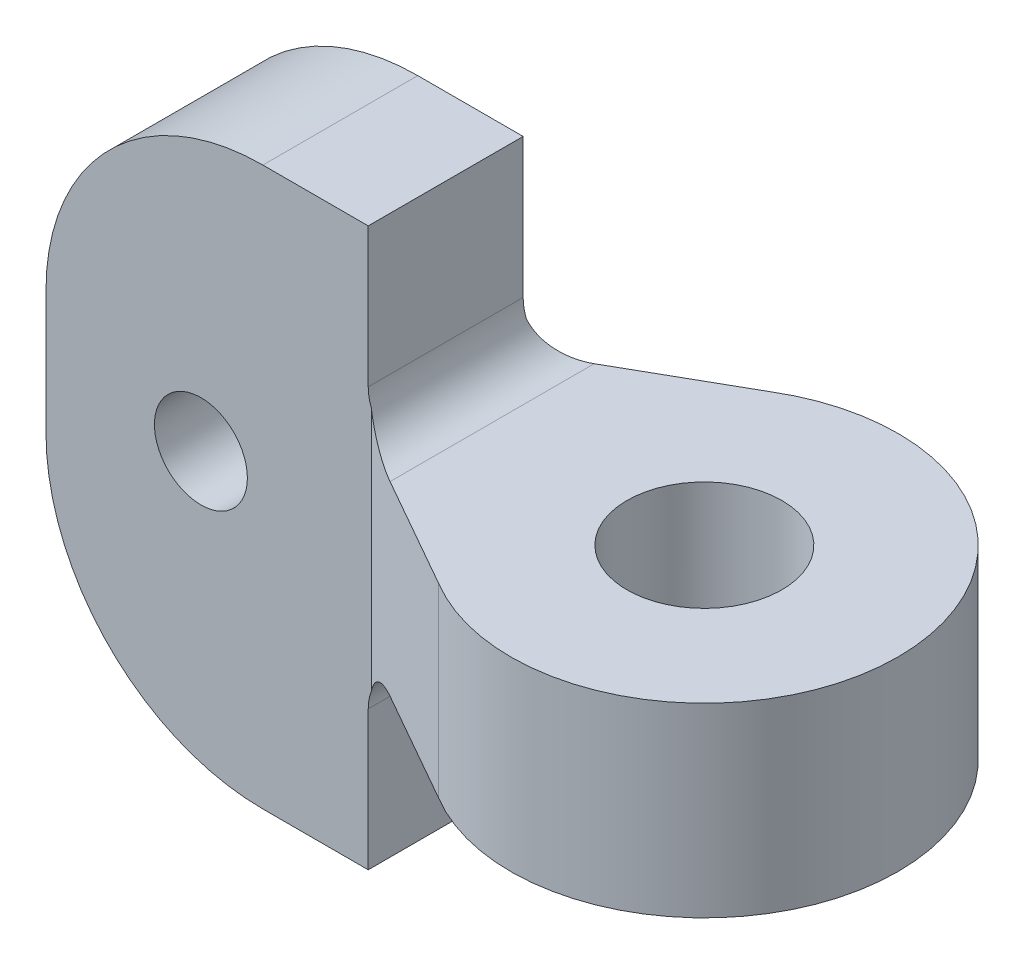
ISO-10303-21;
HEADER;
FILE_DESCRIPTION(('STEP AP214'),'2;1');
FILE_NAME('part.step','',(''),(''),'','','');
FILE_SCHEMA(('AUTOMOTIVE_DESIGN { 1 0 10303 214 1 1 1 1 }'));
ENDSEC;
DATA;
#1=APPLICATION_CONTEXT('core data for automotive mechanical design processes');
#2=APPLICATION_PROTOCOL_DEFINITION('international standard','automotive_design',2000,#1);
#3=PRODUCT_CONTEXT('',#1,'mechanical');
#4=PRODUCT('Part','Part','',(#3));
#5=PRODUCT_RELATED_PRODUCT_CATEGORY('part','',(#4));
#6=PRODUCT_DEFINITION_FORMATION('','',#4);
#7=PRODUCT_DEFINITION_CONTEXT('part definition',#1,'design');
#8=PRODUCT_DEFINITION('design','',#6,#7);
#9=PRODUCT_DEFINITION_SHAPE('','',#8);
#10=(LENGTH_UNIT() NAMED_UNIT(*) SI_UNIT(.MILLI.,.METRE.));
#11=(NAMED_UNIT(*) PLANE_ANGLE_UNIT() SI_UNIT($,.RADIAN.));
#12=(NAMED_UNIT(*) SI_UNIT($,.STERADIAN.) SOLID_ANGLE_UNIT());
#13=UNCERTAINTY_MEASURE_WITH_UNIT(LENGTH_MEASURE(1.E-05),#10,'distance_accuracy_value','');
#14=(GEOMETRIC_REPRESENTATION_CONTEXT(3) GLOBAL_UNCERTAINTY_ASSIGNED_CONTEXT((#13)) GLOBAL_UNIT_ASSIGNED_CONTEXT((#10,
#11,#12)) REPRESENTATION_CONTEXT('',''));
#15=CARTESIAN_POINT('',(0.,0.,0.));
#16=DIRECTION('',(0.,0.,1.));
#17=DIRECTION('',(1.,0.,0.));
#18=AXIS2_PLACEMENT_3D('',#15,#16,#17);
#19=CARTESIAN_POINT('',(23.75,5.1,15.));
#20=DIRECTION('',(0.,1.,0.));
#21=DIRECTION('',(-1.,0.,0.));
#22=AXIS2_PLACEMENT_3D('',#19,#20,#21);
#23=PLANE('',#22);
#24=CARTESIAN_POINT('',(17.5,5.1,7.5));
#25=DIRECTION('',(0.,1.,0.));
#26=DIRECTION('',(-1.,0.,0.));
#27=AXIS2_PLACEMENT_3D('',#24,#25,#26);
#28=CIRCLE('',#27,2.5);
#29=CARTESIAN_POINT('',(15.,5.1,7.5));
#30=VERTEX_POINT('',#29);
#31=EDGE_CURVE('E243',#30,#30,#28,.F.);
#32=ORIENTED_EDGE('',*,*,#31,.F.);
#33=EDGE_LOOP('',(#32));
#34=FACE_BOUND('',#33,.T.);
#35=DIRECTION('',(0.869539977213516,0.,0.493862559855996));
#36=VECTOR('',#35,1.);
#37=CARTESIAN_POINT('',(22.36061288882,5.1,17.4462831062726));
#38=LINE('',#37,#36);
#39=CARTESIAN_POINT('',(10.65,5.1,10.7951418013166));
#40=VERTEX_POINT('',#39);
#41=CARTESIAN_POINT('',(14.2844015285779,5.1,12.8593307857034));
#42=VERTEX_POINT('',#41);
#43=EDGE_CURVE('E235',#40,#42,#38,.T.);
#44=ORIENTED_EDGE('',*,*,#43,.F.);
#45=DIRECTION('',(0.,0.,1.));
#46=VECTOR('',#45,1.);
#47=CARTESIAN_POINT('',(10.65,5.1,5.00000000000001));
#48=LINE('',#47,#46);
#49=CARTESIAN_POINT('',(10.65,5.1,4.20485819868336));
#50=VERTEX_POINT('',#49);
#51=EDGE_CURVE('E263',#40,#50,#48,.F.);
#52=ORIENTED_EDGE('',*,*,#51,.T.);
#53=DIRECTION('',(0.869539977213516,0.,-0.493862559855996));
#54=VECTOR('',#53,1.);
#55=CARTESIAN_POINT('',(15.9191143031631,5.1,1.2122203141402));
#56=LINE('',#55,#54);
#57=CARTESIAN_POINT('',(14.2844015285779,5.1,2.14066921429661));
#58=VERTEX_POINT('',#57);
#59=EDGE_CURVE('E214',#50,#58,#56,.T.);
#60=ORIENTED_EDGE('',*,*,#59,.T.);
#61=CARTESIAN_POINT('',(17.5,5.1,7.5));
#62=DIRECTION('',(0.,1.,0.));
#63=DIRECTION('',(-1.,0.,0.));
#64=AXIS2_PLACEMENT_3D('',#61,#62,#63);
#65=CIRCLE('',#64,6.25);
#66=EDGE_CURVE('E239',#42,#58,#65,.T.);
#67=ORIENTED_EDGE('',*,*,#66,.F.);
#68=EDGE_LOOP('',(#44,#52,#60,#67));
#69=FACE_BOUND('',#68,.T.);
#70=ADVANCED_FACE('F69',(#34,#69),#23,.F.);
#71=CARTESIAN_POINT('',(11.25,11.1,15.));
#72=DIRECTION('',(0.,-1.,0.));
#73=DIRECTION('',(0.,0.,-1.));
#74=AXIS2_PLACEMENT_3D('',#71,#72,#73);
#75=PLANE('',#74);
#76=CARTESIAN_POINT('',(17.5,11.1,7.5));
#77=DIRECTION('',(0.,-1.,0.));
#78=DIRECTION('',(0.,0.,-1.));
#79=AXIS2_PLACEMENT_3D('',#76,#77,#78);
#80=CIRCLE('',#79,2.5);
#81=CARTESIAN_POINT('',(17.5,11.1,5.));
#82=VERTEX_POINT('',#81);
#83=EDGE_CURVE('E242',#82,#82,#80,.F.);
#84=ORIENTED_EDGE('',*,*,#83,.F.);
#85=EDGE_LOOP('',(#84));
#86=FACE_BOUND('',#85,.T.);
#87=DIRECTION('',(-0.869539977213516,0.,0.493862559855996));
#88=VECTOR('',#87,1.);
#89=CARTESIAN_POINT('',(6.46786715350705,11.1,6.5801358021876));
#90=LINE('',#89,#88);
#91=CARTESIAN_POINT('',(14.2844015285779,11.1,2.14066921429661));
#92=VERTEX_POINT('',#91);
#93=CARTESIAN_POINT('',(10.65,11.1,4.20485819868336));
#94=VERTEX_POINT('',#93);
#95=EDGE_CURVE('E211',#92,#94,#90,.T.);
#96=ORIENTED_EDGE('',*,*,#95,.T.);
#97=DIRECTION('',(0.,0.,1.));
#98=VECTOR('',#97,1.);
#99=CARTESIAN_POINT('',(10.65,11.1,9.99999999999999));
#100=LINE('',#99,#98);
#101=CARTESIAN_POINT('',(10.65,11.1,10.7951418013166));
#102=VERTEX_POINT('',#101);
#103=EDGE_CURVE('E265',#94,#102,#100,.T.);
#104=ORIENTED_EDGE('',*,*,#103,.T.);
#105=DIRECTION('',(-0.869539977213516,0.,-0.493862559855996));
#106=VECTOR('',#105,1.);
#107=CARTESIAN_POINT('',(12.9093657391639,11.1,12.0783676182252));
#108=LINE('',#107,#106);
#109=CARTESIAN_POINT('',(14.2844015285779,11.1,12.8593307857034));
#110=VERTEX_POINT('',#109);
#111=EDGE_CURVE('E232',#110,#102,#108,.T.);
#112=ORIENTED_EDGE('',*,*,#111,.F.);
#113=CARTESIAN_POINT('',(17.5,11.1,7.5));
#114=DIRECTION('',(0.,-1.,0.));
#115=DIRECTION('',(0.,0.,-1.));
#116=AXIS2_PLACEMENT_3D('',#113,#114,#115);
#117=CIRCLE('',#116,6.25);
#118=EDGE_CURVE('E237',#92,#110,#117,.T.);
#119=ORIENTED_EDGE('',*,*,#118,.F.);
#120=EDGE_LOOP('',(#96,#104,#112,#119));
#121=FACE_BOUND('',#120,.T.);
#122=ADVANCED_FACE('F292',(#86,#121),#75,.F.);
#123=CARTESIAN_POINT('',(5.75000000000005,17.1,15.));
#124=DIRECTION('',(0.,-1.,0.));
#125=DIRECTION('',(0.,0.,-1.));
#126=AXIS2_PLACEMENT_3D('',#123,#124,#125);
#127=PLANE('',#126);
#128=DIRECTION('',(1.,0.,0.));
#129=VECTOR('',#128,1.);
#130=CARTESIAN_POINT('',(0.,17.1,10.));
#131=LINE('',#130,#129);
#132=CARTESIAN_POINT('',(5.75,17.1,9.99999999999999));
#133=VERTEX_POINT('',#132);
#134=CARTESIAN_POINT('',(9.15,17.1,9.99999999999999));
#135=VERTEX_POINT('',#134);
#136=EDGE_CURVE('E216',#133,#135,#131,.T.);
#137=ORIENTED_EDGE('',*,*,#136,.T.);
#138=DIRECTION('',(0.,0.,1.));
#139=VECTOR('',#138,1.);
#140=CARTESIAN_POINT('',(9.15,17.1,0.));
#141=LINE('',#140,#139);
#142=CARTESIAN_POINT('',(9.15,17.1,5.00000000000001));
#143=VERTEX_POINT('',#142);
#144=EDGE_CURVE('E309',#143,#135,#141,.T.);
#145=ORIENTED_EDGE('',*,*,#144,.F.);
#146=DIRECTION('',(1.,0.,0.));
#147=VECTOR('',#146,1.);
#148=CARTESIAN_POINT('',(0.,17.1,5.));
#149=LINE('',#148,#147);
#150=CARTESIAN_POINT('',(5.75,17.1,5.00000000000001));
#151=VERTEX_POINT('',#150);
#152=EDGE_CURVE('E201',#151,#143,#149,.T.);
#153=ORIENTED_EDGE('',*,*,#152,.F.);
#154=DIRECTION('',(0.,0.,-1.));
#155=VECTOR('',#154,1.);
#156=CARTESIAN_POINT('',(5.75000000000005,17.1,15.));
#157=LINE('',#156,#155);
#158=EDGE_CURVE('E253',#133,#151,#157,.T.);
#159=ORIENTED_EDGE('',*,*,#158,.F.);
#160=EDGE_LOOP('',(#137,#145,#153,#159));
#161=FACE_BOUND('',#160,.T.);
#162=ADVANCED_FACE('F324',(#161),#127,.F.);
#163=CARTESIAN_POINT('',(5.75,10.1,15.));
#164=DIRECTION('',(0.,0.,-1.));
#165=DIRECTION('',(-1.,0.,0.));
#166=AXIS2_PLACEMENT_3D('',#163,#164,#165);
#167=CYLINDRICAL_SURFACE('',#166,7.);
#168=ORIENTED_EDGE('',*,*,#158,.T.);
#169=CARTESIAN_POINT('',(5.75,10.1,5.00000000000001));
#170=DIRECTION('',(0.,0.,1.));
#171=DIRECTION('',(1.,0.,0.));
#172=AXIS2_PLACEMENT_3D('',#169,#170,#171);
#173=CIRCLE('',#172,7.);
#174=CARTESIAN_POINT('',(-1.25,10.1,5.));
#175=VERTEX_POINT('',#174);
#176=EDGE_CURVE('E208',#151,#175,#173,.T.);
#177=ORIENTED_EDGE('',*,*,#176,.T.);
#178=DIRECTION('',(0.,0.,-1.));
#179=VECTOR('',#178,1.);
#180=CARTESIAN_POINT('',(-1.25,10.1,15.));
#181=LINE('',#180,#179);
#182=CARTESIAN_POINT('',(-1.25,10.1,10.));
#183=VERTEX_POINT('',#182);
#184=EDGE_CURVE('E250',#183,#175,#181,.T.);
#185=ORIENTED_EDGE('',*,*,#184,.F.);
#186=CARTESIAN_POINT('',(5.75,10.1,9.99999999999999));
#187=DIRECTION('',(0.,0.,1.));
#188=DIRECTION('',(1.,0.,0.));
#189=AXIS2_PLACEMENT_3D('',#186,#187,#188);
#190=CIRCLE('',#189,7.);
#191=EDGE_CURVE('E230',#133,#183,#190,.T.);
#192=ORIENTED_EDGE('',*,*,#191,.F.);
#193=EDGE_LOOP('',(#168,#177,#185,#192));
#194=FACE_BOUND('',#193,.T.);
#195=ADVANCED_FACE('F326',(#194),#167,.T.);
#196=CARTESIAN_POINT('',(-1.25,6.10000000000005,15.));
#197=DIRECTION('',(1.,0.,0.));
#198=DIRECTION('',(0.,0.,-1.));
#199=AXIS2_PLACEMENT_3D('',#196,#197,#198);
#200=PLANE('',#199);
#201=ORIENTED_EDGE('',*,*,#184,.T.);
#202=DIRECTION('',(0.,-1.,0.));
#203=VECTOR('',#202,1.);
#204=CARTESIAN_POINT('',(-1.25,6.10000000000005,5.));
#205=LINE('',#204,#203);
#206=CARTESIAN_POINT('',(-1.25,6.10000000000005,5.));
#207=VERTEX_POINT('',#206);
#208=EDGE_CURVE('E198',#175,#207,#205,.T.);
#209=ORIENTED_EDGE('',*,*,#208,.T.);
#210=DIRECTION('',(0.,0.,-1.));
#211=VECTOR('',#210,1.);
#212=CARTESIAN_POINT('',(-1.25,6.10000000000005,15.));
#213=LINE('',#212,#211);
#214=CARTESIAN_POINT('',(-1.25,6.10000000000005,10.));
#215=VERTEX_POINT('',#214);
#216=EDGE_CURVE('E247',#215,#207,#213,.T.);
#217=ORIENTED_EDGE('',*,*,#216,.F.);
#218=DIRECTION('',(0.,-1.,0.));
#219=VECTOR('',#218,1.);
#220=CARTESIAN_POINT('',(-1.25,6.10000000000005,10.));
#221=LINE('',#220,#219);
#222=EDGE_CURVE('E228',#183,#215,#221,.T.);
#223=ORIENTED_EDGE('',*,*,#222,.F.);
#224=EDGE_LOOP('',(#201,#209,#217,#223));
#225=FACE_BOUND('',#224,.T.);
#226=ADVANCED_FACE('F332',(#225),#200,.F.);
#227=CARTESIAN_POINT('',(5.75,6.1,15.));
#228=DIRECTION('',(0.,0.,-1.));
#229=DIRECTION('',(-1.,0.,0.));
#230=AXIS2_PLACEMENT_3D('',#227,#228,#229);
#231=CYLINDRICAL_SURFACE('',#230,7.);
#232=ORIENTED_EDGE('',*,*,#216,.T.);
#233=CARTESIAN_POINT('',(5.75,6.1,5.00000000000001));
#234=DIRECTION('',(0.,0.,1.));
#235=DIRECTION('',(1.,0.,0.));
#236=AXIS2_PLACEMENT_3D('',#233,#234,#235);
#237=CIRCLE('',#236,7.);
#238=CARTESIAN_POINT('',(5.75000000000005,-0.9,5.00000000000001));
#239=VERTEX_POINT('',#238);
#240=EDGE_CURVE('E195',#207,#239,#237,.T.);
#241=ORIENTED_EDGE('',*,*,#240,.T.);
#242=DIRECTION('',(0.,0.,-1.));
#243=VECTOR('',#242,1.);
#244=CARTESIAN_POINT('',(5.75000000000005,-0.9,15.));
#245=LINE('',#244,#243);
#246=CARTESIAN_POINT('',(5.75000000000005,-0.9,9.99999999999999));
#247=VERTEX_POINT('',#246);
#248=EDGE_CURVE('E194',#247,#239,#245,.T.);
#249=ORIENTED_EDGE('',*,*,#248,.F.);
#250=CARTESIAN_POINT('',(5.75,6.1,9.99999999999999));
#251=DIRECTION('',(0.,0.,1.));
#252=DIRECTION('',(1.,0.,0.));
#253=AXIS2_PLACEMENT_3D('',#250,#251,#252);
#254=CIRCLE('',#253,7.);
#255=EDGE_CURVE('E226',#215,#247,#254,.T.);
#256=ORIENTED_EDGE('',*,*,#255,.F.);
#257=EDGE_LOOP('',(#232,#241,#249,#256));
#258=FACE_BOUND('',#257,.T.);
#259=ADVANCED_FACE('F334',(#258),#231,.T.);
#260=CARTESIAN_POINT('',(5.75000000000005,-0.9,15.));
#261=DIRECTION('',(0.,1.,0.));
#262=DIRECTION('',(0.,0.,1.));
#263=AXIS2_PLACEMENT_3D('',#260,#261,#262);
#264=PLANE('',#263);
#265=DIRECTION('',(1.,0.,0.));
#266=VECTOR('',#265,1.);
#267=CARTESIAN_POINT('',(5.75000000000005,-0.9,5.00000000000001));
#268=LINE('',#267,#266);
#269=CARTESIAN_POINT('',(9.15,-0.9,5.00000000000001));
#270=VERTEX_POINT('',#269);
#271=EDGE_CURVE('E172',#239,#270,#268,.T.);
#272=ORIENTED_EDGE('',*,*,#271,.T.);
#273=DIRECTION('',(0.,0.,1.));
#274=VECTOR('',#273,1.);
#275=CARTESIAN_POINT('',(9.15,-0.9,0.));
#276=LINE('',#275,#274);
#277=CARTESIAN_POINT('',(9.15,-0.9,9.99999999999999));
#278=VERTEX_POINT('',#277);
#279=EDGE_CURVE('E183',#270,#278,#276,.T.);
#280=ORIENTED_EDGE('',*,*,#279,.T.);
#281=DIRECTION('',(1.,0.,0.));
#282=VECTOR('',#281,1.);
#283=CARTESIAN_POINT('',(5.75000000000005,-0.9,9.99999999999999));
#284=LINE('',#283,#282);
#285=EDGE_CURVE('E224',#247,#278,#284,.T.);
#286=ORIENTED_EDGE('',*,*,#285,.F.);
#287=ORIENTED_EDGE('',*,*,#248,.T.);
#288=EDGE_LOOP('',(#272,#280,#286,#287));
#289=FACE_BOUND('',#288,.T.);
#290=ADVANCED_FACE('F192',(#289),#264,.F.);
#291=CARTESIAN_POINT('',(3.75,8.1,15.));
#292=DIRECTION('',(0.,0.,-1.));
#293=DIRECTION('',(-1.,0.,0.));
#294=AXIS2_PLACEMENT_3D('',#291,#292,#293);
#295=CYLINDRICAL_SURFACE('',#294,1.5);
#296=CARTESIAN_POINT('',(3.75,8.1,5.00000000000001));
#297=DIRECTION('',(0.,0.,1.));
#298=DIRECTION('',(1.,0.,0.));
#299=AXIS2_PLACEMENT_3D('',#296,#297,#298);
#300=CIRCLE('',#299,1.5);
#301=CARTESIAN_POINT('',(5.25,8.1,5.00000000000001));
#302=VERTEX_POINT('',#301);
#303=EDGE_CURVE('E196',#302,#302,#300,.T.);
#304=ORIENTED_EDGE('',*,*,#303,.F.);
#305=EDGE_LOOP('',(#304));
#306=FACE_BOUND('',#305,.T.);
#307=CARTESIAN_POINT('',(3.75,8.1,9.99999999999999));
#308=DIRECTION('',(0.,0.,1.));
#309=DIRECTION('',(1.,0.,0.));
#310=AXIS2_PLACEMENT_3D('',#307,#308,#309);
#311=CIRCLE('',#310,1.5);
#312=CARTESIAN_POINT('',(5.25,8.1,9.99999999999999));
#313=VERTEX_POINT('',#312);
#314=EDGE_CURVE('E222',#313,#313,#311,.T.);
#315=ORIENTED_EDGE('',*,*,#314,.T.);
#316=EDGE_LOOP('',(#315));
#317=FACE_BOUND('',#316,.T.);
#318=ADVANCED_FACE('F359',(#306,#317),#295,.F.);
#319=CARTESIAN_POINT('',(17.5,20.,7.5));
#320=DIRECTION('',(0.,-1.,0.));
#321=DIRECTION('',(0.,0.,-1.));
#322=AXIS2_PLACEMENT_3D('',#319,#320,#321);
#323=CYLINDRICAL_SURFACE('',#322,2.5);
#324=ORIENTED_EDGE('',*,*,#83,.T.);
#325=EDGE_LOOP('',(#324));
#326=FACE_BOUND('',#325,.T.);
#327=ORIENTED_EDGE('',*,*,#31,.T.);
#328=EDGE_LOOP('',(#327));
#329=FACE_BOUND('',#328,.T.);
#330=ADVANCED_FACE('F394',(#326,#329),#323,.F.);
#331=CARTESIAN_POINT('',(17.5,20.,7.5));
#332=DIRECTION('',(0.,-1.,0.));
#333=DIRECTION('',(0.,0.,-1.));
#334=AXIS2_PLACEMENT_3D('',#331,#332,#333);
#335=CYLINDRICAL_SURFACE('',#334,6.25);
#336=ORIENTED_EDGE('',*,*,#66,.T.);
#337=DIRECTION('',(0.,1.,0.));
#338=VECTOR('',#337,1.);
#339=CARTESIAN_POINT('',(14.2844015285779,-4.9,2.14066921429661));
#340=LINE('',#339,#338);
#341=EDGE_CURVE('E297',#58,#92,#340,.T.);
#342=ORIENTED_EDGE('',*,*,#341,.T.);
#343=ORIENTED_EDGE('',*,*,#118,.T.);
#344=DIRECTION('',(0.,1.,0.));
#345=VECTOR('',#344,1.);
#346=CARTESIAN_POINT('',(14.2844015285779,-4.9,12.8593307857034));
#347=LINE('',#346,#345);
#348=EDGE_CURVE('E219',#42,#110,#347,.T.);
#349=ORIENTED_EDGE('',*,*,#348,.F.);
#350=EDGE_LOOP('',(#336,#342,#343,#349));
#351=FACE_BOUND('',#350,.T.);
#352=ADVANCED_FACE('F296',(#351),#335,.T.);
#353=CARTESIAN_POINT('',(-2.03825528118338,-4.9,3.58874025856975));
#354=DIRECTION('',(-0.493862559855996,0.,0.869539977213517));
#355=DIRECTION('',(0.869539977213516,0.,0.493862559855996));
#356=AXIS2_PLACEMENT_3D('',#353,#354,#355);
#357=PLANE('',#356);
#358=DIRECTION('',(0.,1.,0.));
#359=VECTOR('',#358,1.);
#360=CARTESIAN_POINT('',(9.25,-4.9,9.99999999999999));
#361=LINE('',#360,#359);
#362=CARTESIAN_POINT('',(9.25,4.13851648071343,9.99999999999999));
#363=VERTEX_POINT('',#362);
#364=CARTESIAN_POINT('',(9.25,12.0614835192866,9.99999999999999));
#365=VERTEX_POINT('',#364);
#366=EDGE_CURVE('E91',#363,#365,#361,.T.);
#367=ORIENTED_EDGE('',*,*,#366,.F.);
#368=CARTESIAN_POINT('',(10.65,3.6,10.7951418013166));
#369=DIRECTION('',(-0.493862559855996,0.,0.869539977213517));
#370=DIRECTION('',(-0.869539977213516,0.,-0.493862559855996));
#371=AXIS2_PLACEMENT_3D('',#368,#369,#370);
#372=ELLIPSE('',#371,1.72505007165608,1.5);
#373=EDGE_CURVE('E272',#363,#40,#372,.F.);
#374=ORIENTED_EDGE('',*,*,#373,.T.);
#375=ORIENTED_EDGE('',*,*,#43,.T.);
#376=ORIENTED_EDGE('',*,*,#348,.T.);
#377=ORIENTED_EDGE('',*,*,#111,.T.);
#378=CARTESIAN_POINT('',(10.65,12.6,10.7951418013166));
#379=DIRECTION('',(-0.493862559855996,0.,0.869539977213517));
#380=DIRECTION('',(-0.869539977213516,0.,-0.493862559855996));
#381=AXIS2_PLACEMENT_3D('',#378,#379,#380);
#382=ELLIPSE('',#381,1.72505007165608,1.5);
#383=EDGE_CURVE('E277',#102,#365,#382,.F.);
#384=ORIENTED_EDGE('',*,*,#383,.T.);
#385=EDGE_LOOP('',(#367,#374,#375,#376,#377,#384));
#386=FACE_BOUND('',#385,.T.);
#387=ADVANCED_FACE('F299',(#386),#357,.T.);
#388=CARTESIAN_POINT('',(0.,-4.9,10.));
#389=DIRECTION('',(0.,0.,1.));
#390=DIRECTION('',(1.,0.,0.));
#391=AXIS2_PLACEMENT_3D('',#388,#389,#390);
#392=PLANE('',#391);
#393=DIRECTION('',(0.,-1.,0.));
#394=VECTOR('',#393,1.);
#395=CARTESIAN_POINT('',(9.15,-4.9,9.99999999999999));
#396=LINE('',#395,#394);
#397=CARTESIAN_POINT('',(9.15,3.6,9.99999999999999));
#398=VERTEX_POINT('',#397);
#399=EDGE_CURVE('E186',#398,#278,#396,.T.);
#400=ORIENTED_EDGE('',*,*,#399,.F.);
#401=CARTESIAN_POINT('',(10.65,3.6,9.99999999999999));
#402=DIRECTION('',(0.,0.,1.));
#403=DIRECTION('',(1.,0.,0.));
#404=AXIS2_PLACEMENT_3D('',#401,#402,#403);
#405=CIRCLE('',#404,1.5);
#406=EDGE_CURVE('E270',#398,#363,#405,.F.);
#407=ORIENTED_EDGE('',*,*,#406,.T.);
#408=ORIENTED_EDGE('',*,*,#366,.T.);
#409=CARTESIAN_POINT('',(10.65,12.6,9.99999999999999));
#410=DIRECTION('',(0.,0.,1.));
#411=DIRECTION('',(1.,0.,0.));
#412=AXIS2_PLACEMENT_3D('',#409,#410,#411);
#413=CIRCLE('',#412,1.5);
#414=CARTESIAN_POINT('',(9.15,12.6,9.99999999999999));
#415=VERTEX_POINT('',#414);
#416=EDGE_CURVE('E279',#365,#415,#413,.F.);
#417=ORIENTED_EDGE('',*,*,#416,.T.);
#418=DIRECTION('',(0.,-1.,0.));
#419=VECTOR('',#418,1.);
#420=CARTESIAN_POINT('',(9.15,-4.9,9.99999999999999));
#421=LINE('',#420,#419);
#422=EDGE_CURVE('E306',#135,#415,#421,.T.);
#423=ORIENTED_EDGE('',*,*,#422,.F.);
#424=ORIENTED_EDGE('',*,*,#136,.F.);
#425=ORIENTED_EDGE('',*,*,#191,.T.);
#426=ORIENTED_EDGE('',*,*,#222,.T.);
#427=ORIENTED_EDGE('',*,*,#255,.T.);
#428=ORIENTED_EDGE('',*,*,#285,.T.);
#429=EDGE_LOOP('',(#400,#407,#408,#417,#423,#424,#425,#426,#427,#428));
#430=FACE_BOUND('',#429,.T.);
#431=ORIENTED_EDGE('',*,*,#314,.F.);
#432=EDGE_LOOP('',(#431));
#433=FACE_BOUND('',#432,.T.);
#434=ADVANCED_FACE('F319',(#430,#433),#392,.T.);
#435=CARTESIAN_POINT('',(4.4032433044735,-4.9,7.75275632101749));
#436=DIRECTION('',(0.493862559855996,0.,0.869539977213517));
#437=DIRECTION('',(0.869539977213516,0.,-0.493862559855996));
#438=AXIS2_PLACEMENT_3D('',#435,#436,#437);
#439=PLANE('',#438);
#440=ORIENTED_EDGE('',*,*,#59,.F.);
#441=CARTESIAN_POINT('',(10.65,3.6,4.20485819868336));
#442=DIRECTION('',(0.493862559855996,0.,0.869539977213517));
#443=DIRECTION('',(0.869539977213516,0.,-0.493862559855996));
#444=AXIS2_PLACEMENT_3D('',#441,#442,#443);
#445=ELLIPSE('',#444,1.72505007165608,1.5);
#446=CARTESIAN_POINT('',(9.25,4.13851648071345,5.00000000000001));
#447=VERTEX_POINT('',#446);
#448=EDGE_CURVE('E274',#50,#447,#445,.T.);
#449=ORIENTED_EDGE('',*,*,#448,.T.);
#450=DIRECTION('',(0.,1.,0.));
#451=VECTOR('',#450,1.);
#452=CARTESIAN_POINT('',(9.25,-4.9,5.00000000000001));
#453=LINE('',#452,#451);
#454=CARTESIAN_POINT('',(9.25,12.0614835192865,5.00000000000001));
#455=VERTEX_POINT('',#454);
#456=EDGE_CURVE('E83',#447,#455,#453,.T.);
#457=ORIENTED_EDGE('',*,*,#456,.T.);
#458=CARTESIAN_POINT('',(10.65,12.6,4.20485819868336));
#459=DIRECTION('',(0.493862559855996,0.,0.869539977213517));
#460=DIRECTION('',(0.869539977213516,0.,-0.493862559855996));
#461=AXIS2_PLACEMENT_3D('',#458,#459,#460);
#462=ELLIPSE('',#461,1.72505007165608,1.5);
#463=EDGE_CURVE('E12',#455,#94,#462,.T.);
#464=ORIENTED_EDGE('',*,*,#463,.T.);
#465=ORIENTED_EDGE('',*,*,#95,.F.);
#466=ORIENTED_EDGE('',*,*,#341,.F.);
#467=EDGE_LOOP('',(#440,#449,#457,#464,#465,#466));
#468=FACE_BOUND('',#467,.T.);
#469=ADVANCED_FACE('F288',(#468),#439,.F.);
#470=CARTESIAN_POINT('',(0.,-4.9,5.));
#471=DIRECTION('',(0.,0.,1.));
#472=DIRECTION('',(1.,0.,0.));
#473=AXIS2_PLACEMENT_3D('',#470,#471,#472);
#474=PLANE('',#473);
#475=ORIENTED_EDGE('',*,*,#303,.T.);
#476=EDGE_LOOP('',(#475));
#477=FACE_BOUND('',#476,.T.);
#478=ORIENTED_EDGE('',*,*,#456,.F.);
#479=CARTESIAN_POINT('',(10.65,3.6,5.00000000000001));
#480=DIRECTION('',(0.,0.,1.));
#481=DIRECTION('',(1.,0.,0.));
#482=AXIS2_PLACEMENT_3D('',#479,#480,#481);
#483=CIRCLE('',#482,1.5);
#484=CARTESIAN_POINT('',(9.15,3.6,5.00000000000001));
#485=VERTEX_POINT('',#484);
#486=EDGE_CURVE('E175',#447,#485,#483,.T.);
#487=ORIENTED_EDGE('',*,*,#486,.T.);
#488=DIRECTION('',(0.,-1.,0.));
#489=VECTOR('',#488,1.);
#490=CARTESIAN_POINT('',(9.15,-4.9,5.00000000000001));
#491=LINE('',#490,#489);
#492=EDGE_CURVE('E168',#485,#270,#491,.T.);
#493=ORIENTED_EDGE('',*,*,#492,.T.);
#494=ORIENTED_EDGE('',*,*,#271,.F.);
#495=ORIENTED_EDGE('',*,*,#240,.F.);
#496=ORIENTED_EDGE('',*,*,#208,.F.);
#497=ORIENTED_EDGE('',*,*,#176,.F.);
#498=ORIENTED_EDGE('',*,*,#152,.T.);
#499=DIRECTION('',(0.,-1.,0.));
#500=VECTOR('',#499,1.);
#501=CARTESIAN_POINT('',(9.15,-4.9,5.00000000000001));
#502=LINE('',#501,#500);
#503=CARTESIAN_POINT('',(9.15,12.6,5.00000000000001));
#504=VERTEX_POINT('',#503);
#505=EDGE_CURVE('E180',#143,#504,#502,.T.);
#506=ORIENTED_EDGE('',*,*,#505,.T.);
#507=CARTESIAN_POINT('',(10.65,12.6,5.00000000000001));
#508=DIRECTION('',(0.,0.,1.));
#509=DIRECTION('',(1.,0.,0.));
#510=AXIS2_PLACEMENT_3D('',#507,#508,#509);
#511=CIRCLE('',#510,1.5);
#512=EDGE_CURVE('E77',#504,#455,#511,.T.);
#513=ORIENTED_EDGE('',*,*,#512,.T.);
#514=EDGE_LOOP('',(#478,#487,#493,#494,#495,#496,#497,#498,#506,#513));
#515=FACE_BOUND('',#514,.T.);
#516=ADVANCED_FACE('F170',(#477,#515),#474,.F.);
#517=CARTESIAN_POINT('',(9.15,17.1,0.));
#518=DIRECTION('',(-1.,0.,0.));
#519=DIRECTION('',(0.,0.,1.));
#520=AXIS2_PLACEMENT_3D('',#517,#518,#519);
#521=PLANE('',#520);
#522=ORIENTED_EDGE('',*,*,#422,.T.);
#523=DIRECTION('',(0.,0.,1.));
#524=VECTOR('',#523,1.);
#525=CARTESIAN_POINT('',(9.15,12.6,5.00000000000001));
#526=LINE('',#525,#524);
#527=EDGE_CURVE('E268',#415,#504,#526,.F.);
#528=ORIENTED_EDGE('',*,*,#527,.T.);
#529=ORIENTED_EDGE('',*,*,#505,.F.);
#530=ORIENTED_EDGE('',*,*,#144,.T.);
#531=EDGE_LOOP('',(#522,#528,#529,#530));
#532=FACE_BOUND('',#531,.T.);
#533=ADVANCED_FACE('F316',(#532),#521,.F.);
#534=CARTESIAN_POINT('',(9.15,5.1,0.));
#535=DIRECTION('',(-1.,0.,0.));
#536=DIRECTION('',(0.,0.,1.));
#537=AXIS2_PLACEMENT_3D('',#534,#535,#536);
#538=PLANE('',#537);
#539=ORIENTED_EDGE('',*,*,#492,.F.);
#540=DIRECTION('',(0.,0.,1.));
#541=VECTOR('',#540,1.);
#542=CARTESIAN_POINT('',(9.15,3.6,9.99999999999999));
#543=LINE('',#542,#541);
#544=EDGE_CURVE('E179',#485,#398,#543,.T.);
#545=ORIENTED_EDGE('',*,*,#544,.T.);
#546=ORIENTED_EDGE('',*,*,#399,.T.);
#547=ORIENTED_EDGE('',*,*,#279,.F.);
#548=EDGE_LOOP('',(#539,#545,#546,#547));
#549=FACE_BOUND('',#548,.T.);
#550=ADVANCED_FACE('F184',(#549),#538,.F.);
#551=CARTESIAN_POINT('',(10.65,3.6,0.));
#552=DIRECTION('',(0.,0.,-1.));
#553=DIRECTION('',(-1.,0.,0.));
#554=AXIS2_PLACEMENT_3D('',#551,#552,#553);
#555=CYLINDRICAL_SURFACE('',#554,1.5);
#556=ORIENTED_EDGE('',*,*,#448,.F.);
#557=ORIENTED_EDGE('',*,*,#51,.F.);
#558=ORIENTED_EDGE('',*,*,#373,.F.);
#559=ORIENTED_EDGE('',*,*,#406,.F.);
#560=ORIENTED_EDGE('',*,*,#544,.F.);
#561=ORIENTED_EDGE('',*,*,#486,.F.);
#562=EDGE_LOOP('',(#556,#557,#558,#559,#560,#561));
#563=FACE_BOUND('',#562,.T.);
#564=ADVANCED_FACE('F336',(#563),#555,.F.);
#565=CARTESIAN_POINT('',(10.65,12.6,15.));
#566=DIRECTION('',(0.,0.,-1.));
#567=DIRECTION('',(-1.,0.,0.));
#568=AXIS2_PLACEMENT_3D('',#565,#566,#567);
#569=CYLINDRICAL_SURFACE('',#568,1.5);
#570=ORIENTED_EDGE('',*,*,#512,.F.);
#571=ORIENTED_EDGE('',*,*,#527,.F.);
#572=ORIENTED_EDGE('',*,*,#416,.F.);
#573=ORIENTED_EDGE('',*,*,#383,.F.);
#574=ORIENTED_EDGE('',*,*,#103,.F.);
#575=ORIENTED_EDGE('',*,*,#463,.F.);
#576=EDGE_LOOP('',(#570,#571,#572,#573,#574,#575));
#577=FACE_BOUND('',#576,.T.);
#578=ADVANCED_FACE('F71',(#577),#569,.F.);
#579=CLOSED_SHELL('',(#70,#122,#162,#195,#226,#259,#290,#318,#330,#352,#387,#434,#469,#516,#533,
#550,#564,#578));
#580=MANIFOLD_SOLID_BREP('B2',#579);
#581=ADVANCED_BREP_SHAPE_REPRESENTATION('',(#18,#580),#14);
#582=SHAPE_DEFINITION_REPRESENTATION(#9,#581);
ENDSEC;
END-ISO-10303-21;
